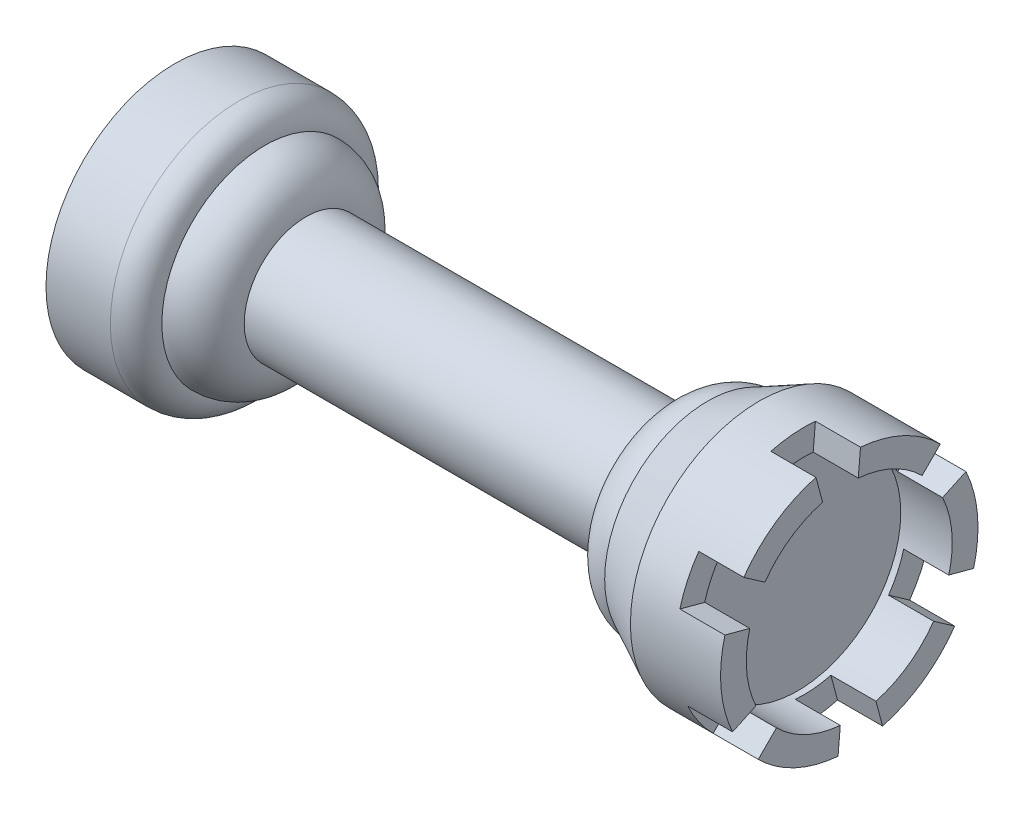
ISO-10303-21;
HEADER;
FILE_DESCRIPTION(('STEP AP214'),'2;1');
FILE_NAME('part.step','',(''),(''),'','','');
FILE_SCHEMA(('AUTOMOTIVE_DESIGN { 1 0 10303 214 1 1 1 1 }'));
ENDSEC;
DATA;
#1=APPLICATION_CONTEXT('core data for automotive mechanical design processes');
#2=APPLICATION_PROTOCOL_DEFINITION('international standard','automotive_design',2000,#1);
#3=PRODUCT_CONTEXT('',#1,'mechanical');
#4=PRODUCT('Part','Part','',(#3));
#5=PRODUCT_RELATED_PRODUCT_CATEGORY('part','',(#4));
#6=PRODUCT_DEFINITION_FORMATION('','',#4);
#7=PRODUCT_DEFINITION_CONTEXT('part definition',#1,'design');
#8=PRODUCT_DEFINITION('design','',#6,#7);
#9=PRODUCT_DEFINITION_SHAPE('','',#8);
#10=(LENGTH_UNIT() NAMED_UNIT(*) SI_UNIT(.MILLI.,.METRE.));
#11=(NAMED_UNIT(*) PLANE_ANGLE_UNIT() SI_UNIT($,.RADIAN.));
#12=(NAMED_UNIT(*) SI_UNIT($,.STERADIAN.) SOLID_ANGLE_UNIT());
#13=UNCERTAINTY_MEASURE_WITH_UNIT(LENGTH_MEASURE(1.E-05),#10,'distance_accuracy_value','');
#14=(GEOMETRIC_REPRESENTATION_CONTEXT(3) GLOBAL_UNCERTAINTY_ASSIGNED_CONTEXT((#13)) GLOBAL_UNIT_ASSIGNED_CONTEXT((#10,
#11,#12)) REPRESENTATION_CONTEXT('',''));
#15=CARTESIAN_POINT('',(0.,0.,0.));
#16=DIRECTION('',(0.,0.,1.));
#17=DIRECTION('',(1.,0.,0.));
#18=AXIS2_PLACEMENT_3D('',#15,#16,#17);
#19=CARTESIAN_POINT('',(10.2,0.,0.));
#20=DIRECTION('',(1.,0.,0.));
#21=DIRECTION('',(0.,0.,-1.));
#22=AXIS2_PLACEMENT_3D('',#19,#20,#21);
#23=PLANE('',#22);
#24=CARTESIAN_POINT('',(10.2,0.,0.));
#25=DIRECTION('',(-1.,0.,0.));
#26=DIRECTION('',(0.,0.,1.));
#27=AXIS2_PLACEMENT_3D('',#24,#25,#26);
#28=CIRCLE('',#27,4.8);
#29=CARTESIAN_POINT('',(10.2,0.,4.8));
#30=VERTEX_POINT('',#29);
#31=EDGE_CURVE('E11',#30,#30,#28,.T.);
#32=ORIENTED_EDGE('',*,*,#31,.F.);
#33=EDGE_LOOP('',(#32));
#34=FACE_BOUND('',#33,.T.);
#35=ADVANCED_FACE('F56',(#34),#23,.T.);
#36=CARTESIAN_POINT('',(7.,0.,0.));
#37=DIRECTION('',(-1.,0.,0.));
#38=DIRECTION('',(0.,0.,1.));
#39=AXIS2_PLACEMENT_3D('',#36,#37,#38);
#40=TOROIDAL_SURFACE('',#39,4.8,3.2);
#41=ORIENTED_EDGE('',*,*,#31,.T.);
#42=EDGE_LOOP('',(#41));
#43=FACE_BOUND('',#42,.T.);
#44=CARTESIAN_POINT('',(7.,0.,0.));
#45=DIRECTION('',(-1.,0.,0.));
#46=DIRECTION('',(0.,0.,1.));
#47=AXIS2_PLACEMENT_3D('',#44,#45,#46);
#48=CIRCLE('',#47,8.);
#49=CARTESIAN_POINT('',(7.,0.,8.));
#50=VERTEX_POINT('',#49);
#51=EDGE_CURVE('E63',#50,#50,#48,.T.);
#52=ORIENTED_EDGE('',*,*,#51,.F.);
#53=EDGE_LOOP('',(#52));
#54=FACE_BOUND('',#53,.T.);
#55=ADVANCED_FACE('F109',(#43,#54),#40,.T.);
#56=CARTESIAN_POINT('',(5.,0.,0.));
#57=DIRECTION('',(-1.,0.,0.));
#58=DIRECTION('',(0.,0.,1.));
#59=AXIS2_PLACEMENT_3D('',#56,#57,#58);
#60=TOROIDAL_SURFACE('',#59,8.,2.);
#61=ORIENTED_EDGE('',*,*,#51,.T.);
#62=EDGE_LOOP('',(#61));
#63=FACE_BOUND('',#62,.T.);
#64=CARTESIAN_POINT('',(5.,0.,0.));
#65=DIRECTION('',(-1.,0.,0.));
#66=DIRECTION('',(0.,0.,1.));
#67=AXIS2_PLACEMENT_3D('',#64,#65,#66);
#68=CIRCLE('',#67,10.);
#69=CARTESIAN_POINT('',(5.,0.,10.));
#70=VERTEX_POINT('',#69);
#71=EDGE_CURVE('E67',#70,#70,#68,.T.);
#72=ORIENTED_EDGE('',*,*,#71,.F.);
#73=EDGE_LOOP('',(#72));
#74=FACE_BOUND('',#73,.T.);
#75=ADVANCED_FACE('F106',(#63,#74),#60,.T.);
#76=CARTESIAN_POINT('',(0.,0.,0.));
#77=DIRECTION('',(-1.,0.,0.));
#78=DIRECTION('',(0.,0.,1.));
#79=AXIS2_PLACEMENT_3D('',#76,#77,#78);
#80=CYLINDRICAL_SURFACE('',#79,10.);
#81=ORIENTED_EDGE('',*,*,#71,.T.);
#82=EDGE_LOOP('',(#81));
#83=FACE_BOUND('',#82,.T.);
#84=CARTESIAN_POINT('',(0.,0.,0.));
#85=DIRECTION('',(-1.,0.,0.));
#86=DIRECTION('',(0.,0.,1.));
#87=AXIS2_PLACEMENT_3D('',#84,#85,#86);
#88=CIRCLE('',#87,10.);
#89=CARTESIAN_POINT('',(0.,0.,10.));
#90=VERTEX_POINT('',#89);
#91=EDGE_CURVE('E71',#90,#90,#88,.T.);
#92=ORIENTED_EDGE('',*,*,#91,.F.);
#93=EDGE_LOOP('',(#92));
#94=FACE_BOUND('',#93,.T.);
#95=ADVANCED_FACE('F102',(#83,#94),#80,.T.);
#96=CARTESIAN_POINT('',(0.,0.,0.));
#97=DIRECTION('',(-1.,0.,0.));
#98=DIRECTION('',(0.,0.,1.));
#99=AXIS2_PLACEMENT_3D('',#96,#97,#98);
#100=PLANE('',#99);
#101=ORIENTED_EDGE('',*,*,#91,.T.);
#102=EDGE_LOOP('',(#101));
#103=FACE_BOUND('',#102,.T.);
#104=ADVANCED_FACE('F100',(#103),#100,.T.);
#105=CLOSED_SHELL('',(#35,#55,#75,#95,#104));
#106=CARTESIAN_POINT('',(1.,0.,0.));
#107=DIRECTION('',(-1.,0.,0.));
#108=DIRECTION('',(0.,0.,1.));
#109=AXIS2_PLACEMENT_3D('',#106,#107,#108);
#110=PLANE('',#109);
#111=CARTESIAN_POINT('',(1.,0.,0.));
#112=DIRECTION('',(-1.,0.,0.));
#113=DIRECTION('',(0.,0.,1.));
#114=AXIS2_PLACEMENT_3D('',#111,#112,#113);
#115=CIRCLE('',#114,5.25);
#116=CARTESIAN_POINT('',(1.,0.,5.25));
#117=VERTEX_POINT('',#116);
#118=EDGE_CURVE('E76',#117,#117,#115,.T.);
#119=ORIENTED_EDGE('',*,*,#118,.F.);
#120=EDGE_LOOP('',(#119));
#121=FACE_BOUND('',#120,.T.);
#122=ADVANCED_FACE('F88',(#121),#110,.F.);
#123=CARTESIAN_POINT('',(0.,0.,0.));
#124=DIRECTION('',(-1.,0.,0.));
#125=DIRECTION('',(0.,0.,1.));
#126=AXIS2_PLACEMENT_3D('',#123,#124,#125);
#127=CYLINDRICAL_SURFACE('',#126,5.25);
#128=CARTESIAN_POINT('',(3.5,0.,0.));
#129=DIRECTION('',(-1.,0.,0.));
#130=DIRECTION('',(0.,0.,1.));
#131=AXIS2_PLACEMENT_3D('',#128,#129,#130);
#132=CIRCLE('',#131,5.25);
#133=CARTESIAN_POINT('',(3.5,0.,5.25));
#134=VERTEX_POINT('',#133);
#135=EDGE_CURVE('E79',#134,#134,#132,.T.);
#136=ORIENTED_EDGE('',*,*,#135,.F.);
#137=EDGE_LOOP('',(#136));
#138=FACE_BOUND('',#137,.T.);
#139=ORIENTED_EDGE('',*,*,#118,.T.);
#140=EDGE_LOOP('',(#139));
#141=FACE_BOUND('',#140,.T.);
#142=ADVANCED_FACE('F85',(#138,#141),#127,.F.);
#143=CARTESIAN_POINT('',(3.5,0.,0.));
#144=DIRECTION('',(1.,0.,0.));
#145=DIRECTION('',(0.,0.,-1.));
#146=AXIS2_PLACEMENT_3D('',#143,#144,#145);
#147=PLANE('',#146);
#148=ORIENTED_EDGE('',*,*,#135,.T.);
#149=EDGE_LOOP('',(#148));
#150=FACE_BOUND('',#149,.T.);
#151=ADVANCED_FACE('F83',(#150),#147,.F.);
#152=CLOSED_SHELL('',(#122,#142,#151));
#153=ORIENTED_CLOSED_SHELL('',*,#152,.T.);
#154=BREP_WITH_VOIDS('B2',#105,(#153));
#155=CARTESIAN_POINT('',(52.4,10.,0.));
#156=DIRECTION('',(1.,0.,0.));
#157=DIRECTION('',(0.,0.,-1.));
#158=AXIS2_PLACEMENT_3D('',#155,#156,#157);
#159=PLANE('',#158);
#160=DIRECTION('',(0.,-0.422618261740688,0.906307787036655));
#161=VECTOR('',#160,1.);
#162=CARTESIAN_POINT('',(52.4,-4.22618261740688,9.06307787036655));
#163=LINE('',#162,#161);
#164=CARTESIAN_POINT('',(52.4,-3.3809460939255,7.25046229629324));
#165=VERTEX_POINT('',#164);
#166=CARTESIAN_POINT('',(52.4,-4.22618261740688,9.06307787036655));
#167=VERTEX_POINT('',#166);
#168=EDGE_CURVE('E577',#165,#167,#163,.T.);
#169=ORIENTED_EDGE('',*,*,#168,.F.);
#170=CARTESIAN_POINT('',(52.4,0.,0.));
#171=DIRECTION('',(1.,0.,0.));
#172=DIRECTION('',(0.,0.,-1.));
#173=AXIS2_PLACEMENT_3D('',#170,#171,#172);
#174=CIRCLE('',#173,8.);
#175=CARTESIAN_POINT('',(52.4,2.07055236082017,7.72740661031255));
#176=VERTEX_POINT('',#175);
#177=EDGE_CURVE('E664',#176,#165,#174,.T.);
#178=ORIENTED_EDGE('',*,*,#177,.F.);
#179=DIRECTION('',(0.,-0.258819045102521,-0.965925826289068));
#180=VECTOR('',#179,1.);
#181=CARTESIAN_POINT('',(52.4,2.58819045102521,9.65925826289068));
#182=LINE('',#181,#180);
#183=CARTESIAN_POINT('',(52.4,2.58819045102521,9.65925826289068));
#184=VERTEX_POINT('',#183);
#185=EDGE_CURVE('E441',#184,#176,#182,.T.);
#186=ORIENTED_EDGE('',*,*,#185,.F.);
#187=CARTESIAN_POINT('',(52.4,0.,0.));
#188=DIRECTION('',(1.,0.,0.));
#189=DIRECTION('',(0.,0.,-1.));
#190=AXIS2_PLACEMENT_3D('',#187,#188,#189);
#191=CIRCLE('',#190,10.);
#192=EDGE_CURVE('E371',#184,#167,#191,.T.);
#193=ORIENTED_EDGE('',*,*,#192,.T.);
#194=EDGE_LOOP('',(#169,#178,#186,#193));
#195=FACE_BOUND('',#194,.T.);
#196=ADVANCED_FACE('F168',(#195),#159,.T.);
#197=DIRECTION('',(0.,0.707106781186539,-0.707106781186556));
#198=VECTOR('',#197,1.);
#199=CARTESIAN_POINT('',(52.4,-7.07106781186539,7.07106781186556));
#200=LINE('',#199,#198);
#201=CARTESIAN_POINT('',(52.4,-7.07106781186539,7.07106781186556));
#202=VERTEX_POINT('',#201);
#203=CARTESIAN_POINT('',(52.4,-5.65685424949231,5.65685424949245));
#204=VERTEX_POINT('',#203);
#205=EDGE_CURVE('E546',#202,#204,#200,.T.);
#206=ORIENTED_EDGE('',*,*,#205,.F.);
#207=CARTESIAN_POINT('',(52.4,-9.96194698091745,0.871557427476686));
#208=VERTEX_POINT('',#207);
#209=EDGE_CURVE('E384',#202,#208,#191,.T.);
#210=ORIENTED_EDGE('',*,*,#209,.T.);
#211=DIRECTION('',(0.,-0.996194698091745,0.0871557427476683));
#212=VECTOR('',#211,1.);
#213=CARTESIAN_POINT('',(52.4,-9.96194698091745,0.871557427476686));
#214=LINE('',#213,#212);
#215=CARTESIAN_POINT('',(52.4,-7.96955758473396,0.697245941981348));
#216=VERTEX_POINT('',#215);
#217=EDGE_CURVE('E547',#216,#208,#214,.T.);
#218=ORIENTED_EDGE('',*,*,#217,.F.);
#219=EDGE_CURVE('E407',#204,#216,#174,.T.);
#220=ORIENTED_EDGE('',*,*,#219,.F.);
#221=EDGE_LOOP('',(#206,#210,#218,#220));
#222=FACE_BOUND('',#221,.T.);
#223=ADVANCED_FACE('F690',(#222),#159,.T.);
#224=DIRECTION('',(0.,0.965925826289071,0.258819045102511));
#225=VECTOR('',#224,1.);
#226=CARTESIAN_POINT('',(52.4,-9.65925826289071,-2.58819045102511));
#227=LINE('',#226,#225);
#228=CARTESIAN_POINT('',(52.4,-9.65925826289071,-2.58819045102511));
#229=VERTEX_POINT('',#228);
#230=CARTESIAN_POINT('',(52.4,-7.72740661031257,-2.07055236082009));
#231=VERTEX_POINT('',#230);
#232=EDGE_CURVE('E512',#229,#231,#227,.T.);
#233=ORIENTED_EDGE('',*,*,#232,.F.);
#234=CARTESIAN_POINT('',(52.4,-5.73576436351053,-8.19152044288987));
#235=VERTEX_POINT('',#234);
#236=EDGE_CURVE('E375',#229,#235,#191,.T.);
#237=ORIENTED_EDGE('',*,*,#236,.T.);
#238=DIRECTION('',(0.,-0.573576436351053,-0.819152044288987));
#239=VECTOR('',#238,1.);
#240=CARTESIAN_POINT('',(52.4,-5.73576436351053,-8.19152044288987));
#241=LINE('',#240,#239);
#242=CARTESIAN_POINT('',(52.4,-4.58861149080842,-6.5532163543119));
#243=VERTEX_POINT('',#242);
#244=EDGE_CURVE('E513',#243,#235,#241,.T.);
#245=ORIENTED_EDGE('',*,*,#244,.F.);
#246=EDGE_CURVE('E398',#231,#243,#174,.T.);
#247=ORIENTED_EDGE('',*,*,#246,.F.);
#248=EDGE_LOOP('',(#233,#237,#245,#247));
#249=FACE_BOUND('',#248,.T.);
#250=ADVANCED_FACE('F646',(#249),#159,.T.);
#251=DIRECTION('',(0.,0.258819045102528,0.965925826289066));
#252=VECTOR('',#251,1.);
#253=CARTESIAN_POINT('',(52.4,-2.58819045102528,-9.65925826289066));
#254=LINE('',#253,#252);
#255=CARTESIAN_POINT('',(52.4,-2.58819045102528,-9.65925826289066));
#256=VERTEX_POINT('',#255);
#257=CARTESIAN_POINT('',(52.4,-2.07055236082022,-7.72740661031253));
#258=VERTEX_POINT('',#257);
#259=EDGE_CURVE('E479',#256,#258,#254,.T.);
#260=ORIENTED_EDGE('',*,*,#259,.F.);
#261=CARTESIAN_POINT('',(52.4,4.22618261740694,-9.06307787036653));
#262=VERTEX_POINT('',#261);
#263=EDGE_CURVE('E364',#256,#262,#191,.T.);
#264=ORIENTED_EDGE('',*,*,#263,.T.);
#265=DIRECTION('',(0.,0.422618261740694,-0.906307787036653));
#266=VECTOR('',#265,1.);
#267=CARTESIAN_POINT('',(52.4,4.22618261740694,-9.06307787036653));
#268=LINE('',#267,#266);
#269=CARTESIAN_POINT('',(52.4,3.38094609392555,-7.25046229629322));
#270=VERTEX_POINT('',#269);
#271=EDGE_CURVE('E480',#270,#262,#268,.T.);
#272=ORIENTED_EDGE('',*,*,#271,.F.);
#273=EDGE_CURVE('E392',#258,#270,#174,.T.);
#274=ORIENTED_EDGE('',*,*,#273,.F.);
#275=EDGE_LOOP('',(#260,#264,#272,#274));
#276=FACE_BOUND('',#275,.T.);
#277=ADVANCED_FACE('F628',(#276),#159,.T.);
#278=DIRECTION('',(0.,-0.707106781186543,0.707106781186552));
#279=VECTOR('',#278,1.);
#280=CARTESIAN_POINT('',(52.4,7.07106781186544,-7.07106781186551));
#281=LINE('',#280,#279);
#282=CARTESIAN_POINT('',(52.4,7.07106781186544,-7.07106781186551));
#283=VERTEX_POINT('',#282);
#284=CARTESIAN_POINT('',(52.4,5.65685424949235,-5.65685424949241));
#285=VERTEX_POINT('',#284);
#286=EDGE_CURVE('E356',#283,#285,#281,.T.);
#287=ORIENTED_EDGE('',*,*,#286,.F.);
#288=CARTESIAN_POINT('',(52.4,9.96194698091745,-0.871557427476619));
#289=VERTEX_POINT('',#288);
#290=EDGE_CURVE('E352',#283,#289,#191,.T.);
#291=ORIENTED_EDGE('',*,*,#290,.T.);
#292=DIRECTION('',(0.,0.996194698091745,-0.0871557427476618));
#293=VECTOR('',#292,1.);
#294=CARTESIAN_POINT('',(52.4,9.96194698091745,-0.871557427476619));
#295=LINE('',#294,#293);
#296=CARTESIAN_POINT('',(52.4,7.96955758473396,-0.697245941981296));
#297=VERTEX_POINT('',#296);
#298=EDGE_CURVE('E329',#297,#289,#295,.T.);
#299=ORIENTED_EDGE('',*,*,#298,.F.);
#300=EDGE_CURVE('E386',#285,#297,#174,.T.);
#301=ORIENTED_EDGE('',*,*,#300,.F.);
#302=EDGE_LOOP('',(#287,#291,#299,#301));
#303=FACE_BOUND('',#302,.T.);
#304=ADVANCED_FACE('F359',(#303),#159,.T.);
#305=CARTESIAN_POINT('',(41.4,0.,0.));
#306=DIRECTION('',(1.,0.,0.));
#307=DIRECTION('',(0.,0.,-1.));
#308=AXIS2_PLACEMENT_3D('',#305,#306,#307);
#309=CONICAL_SURFACE('',#308,8.,0.463647609000806);
#310=CARTESIAN_POINT('',(45.4,0.,0.));
#311=DIRECTION('',(1.,0.,0.));
#312=DIRECTION('',(0.,0.,-1.));
#313=AXIS2_PLACEMENT_3D('',#310,#311,#312);
#314=CIRCLE('',#313,10.);
#315=CARTESIAN_POINT('',(45.4,0.,-10.));
#316=VERTEX_POINT('',#315);
#317=EDGE_CURVE('E361',#316,#316,#314,.T.);
#318=ORIENTED_EDGE('',*,*,#317,.F.);
#319=EDGE_LOOP('',(#318));
#320=FACE_BOUND('',#319,.T.);
#321=CARTESIAN_POINT('',(41.4,0.,0.));
#322=DIRECTION('',(-1.,0.,0.));
#323=DIRECTION('',(0.,0.,1.));
#324=AXIS2_PLACEMENT_3D('',#321,#322,#323);
#325=CIRCLE('',#324,8.);
#326=CARTESIAN_POINT('',(41.4,0.,8.));
#327=VERTEX_POINT('',#326);
#328=EDGE_CURVE('E53',#327,#327,#325,.T.);
#329=ORIENTED_EDGE('',*,*,#328,.F.);
#330=EDGE_LOOP('',(#329));
#331=FACE_BOUND('',#330,.T.);
#332=ADVANCED_FACE('F170',(#320,#331),#309,.T.);
#333=CARTESIAN_POINT('',(41.4,0.,0.));
#334=DIRECTION('',(-1.,0.,0.));
#335=DIRECTION('',(0.,0.,1.));
#336=AXIS2_PLACEMENT_3D('',#333,#334,#335);
#337=TOROIDAL_SURFACE('',#336,4.8,3.2);
#338=ORIENTED_EDGE('',*,*,#328,.T.);
#339=EDGE_LOOP('',(#338));
#340=FACE_BOUND('',#339,.T.);
#341=CARTESIAN_POINT('',(38.2,0.,0.));
#342=DIRECTION('',(-1.,0.,0.));
#343=DIRECTION('',(0.,0.,1.));
#344=AXIS2_PLACEMENT_3D('',#341,#342,#343);
#345=CIRCLE('',#344,4.8);
#346=CARTESIAN_POINT('',(38.2,0.,4.8));
#347=VERTEX_POINT('',#346);
#348=EDGE_CURVE('E177',#347,#347,#345,.T.);
#349=ORIENTED_EDGE('',*,*,#348,.F.);
#350=EDGE_LOOP('',(#349));
#351=FACE_BOUND('',#350,.T.);
#352=ADVANCED_FACE('F710',(#340,#351),#337,.T.);
#353=CARTESIAN_POINT('',(10.2,0.,0.));
#354=DIRECTION('',(-1.,0.,0.));
#355=DIRECTION('',(0.,0.,1.));
#356=AXIS2_PLACEMENT_3D('',#353,#354,#355);
#357=CYLINDRICAL_SURFACE('',#356,4.8);
#358=ORIENTED_EDGE('',*,*,#348,.T.);
#359=EDGE_LOOP('',(#358));
#360=FACE_BOUND('',#359,.T.);
#361=CARTESIAN_POINT('',(10.2,0.,0.));
#362=DIRECTION('',(-1.,0.,0.));
#363=DIRECTION('',(0.,0.,1.));
#364=AXIS2_PLACEMENT_3D('',#361,#362,#363);
#365=CIRCLE('',#364,4.8);
#366=CARTESIAN_POINT('',(10.2,0.,4.8));
#367=VERTEX_POINT('',#366);
#368=EDGE_CURVE('E368',#367,#367,#365,.T.);
#369=ORIENTED_EDGE('',*,*,#368,.F.);
#370=EDGE_LOOP('',(#369));
#371=FACE_BOUND('',#370,.T.);
#372=ADVANCED_FACE('F880',(#360,#371),#357,.T.);
#373=CARTESIAN_POINT('',(10.2,0.,0.));
#374=DIRECTION('',(1.,0.,0.));
#375=DIRECTION('',(0.,0.,-1.));
#376=AXIS2_PLACEMENT_3D('',#373,#374,#375);
#377=PLANE('',#376);
#378=ORIENTED_EDGE('',*,*,#368,.T.);
#379=EDGE_LOOP('',(#378));
#380=FACE_BOUND('',#379,.T.);
#381=ADVANCED_FACE('F704',(#380),#377,.F.);
#382=CARTESIAN_POINT('',(52.4,0.,0.));
#383=DIRECTION('',(1.,0.,0.));
#384=DIRECTION('',(0.,0.,-1.));
#385=AXIS2_PLACEMENT_3D('',#382,#383,#384);
#386=CYLINDRICAL_SURFACE('',#385,10.);
#387=DIRECTION('',(1.,0.,0.));
#388=VECTOR('',#387,1.);
#389=CARTESIAN_POINT('',(48.9,-4.22618261740688,9.06307787036655));
#390=LINE('',#389,#388);
#391=CARTESIAN_POINT('',(48.9,-4.22618261740688,9.06307787036655));
#392=VERTEX_POINT('',#391);
#393=EDGE_CURVE('E574',#392,#167,#390,.T.);
#394=ORIENTED_EDGE('',*,*,#393,.T.);
#395=ORIENTED_EDGE('',*,*,#192,.F.);
#396=DIRECTION('',(1.,0.,0.));
#397=VECTOR('',#396,1.);
#398=CARTESIAN_POINT('',(48.9,2.58819045102521,9.65925826289068));
#399=LINE('',#398,#397);
#400=CARTESIAN_POINT('',(48.9,2.58819045102521,9.65925826289068));
#401=VERTEX_POINT('',#400);
#402=EDGE_CURVE('E394',#401,#184,#399,.T.);
#403=ORIENTED_EDGE('',*,*,#402,.F.);
#404=CARTESIAN_POINT('',(48.9,0.,0.));
#405=DIRECTION('',(1.,0.,0.));
#406=DIRECTION('',(0.,0.,1.));
#407=AXIS2_PLACEMENT_3D('',#404,#405,#406);
#408=CIRCLE('',#407,10.);
#409=CARTESIAN_POINT('',(48.9,5.73576436351047,8.19152044288991));
#410=VERTEX_POINT('',#409);
#411=EDGE_CURVE('E445',#410,#401,#408,.T.);
#412=ORIENTED_EDGE('',*,*,#411,.F.);
#413=DIRECTION('',(1.,0.,0.));
#414=VECTOR('',#413,1.);
#415=CARTESIAN_POINT('',(48.9,5.73576436351047,8.19152044288991));
#416=LINE('',#415,#414);
#417=CARTESIAN_POINT('',(52.4,5.73576436351047,8.19152044288991));
#418=VERTEX_POINT('',#417);
#419=EDGE_CURVE('E399',#410,#418,#416,.T.);
#420=ORIENTED_EDGE('',*,*,#419,.T.);
#421=CARTESIAN_POINT('',(52.4,9.65925826289069,2.58819045102518));
#422=VERTEX_POINT('',#421);
#423=EDGE_CURVE('E362',#422,#418,#191,.T.);
#424=ORIENTED_EDGE('',*,*,#423,.F.);
#425=DIRECTION('',(1.,0.,0.));
#426=VECTOR('',#425,1.);
#427=CARTESIAN_POINT('',(48.9,9.65925826289069,2.58819045102518));
#428=LINE('',#427,#426);
#429=CARTESIAN_POINT('',(48.9,9.65925826289069,2.58819045102518));
#430=VERTEX_POINT('',#429);
#431=EDGE_CURVE('E456',#430,#422,#428,.T.);
#432=ORIENTED_EDGE('',*,*,#431,.F.);
#433=CARTESIAN_POINT('',(48.9,0.,0.));
#434=DIRECTION('',(1.,0.,0.));
#435=DIRECTION('',(0.,0.,1.));
#436=AXIS2_PLACEMENT_3D('',#433,#434,#435);
#437=CIRCLE('',#436,10.);
#438=CARTESIAN_POINT('',(48.9,9.96194698091745,-0.871557427476619));
#439=VERTEX_POINT('',#438);
#440=EDGE_CURVE('E343',#439,#430,#437,.T.);
#441=ORIENTED_EDGE('',*,*,#440,.F.);
#442=DIRECTION('',(1.,0.,0.));
#443=VECTOR('',#442,1.);
#444=CARTESIAN_POINT('',(48.9,9.96194698091745,-0.871557427476619));
#445=LINE('',#444,#443);
#446=EDGE_CURVE('E333',#439,#289,#445,.T.);
#447=ORIENTED_EDGE('',*,*,#446,.T.);
#448=ORIENTED_EDGE('',*,*,#290,.F.);
#449=DIRECTION('',(1.,0.,0.));
#450=VECTOR('',#449,1.);
#451=CARTESIAN_POINT('',(48.9,7.07106781186544,-7.07106781186551));
#452=LINE('',#451,#450);
#453=CARTESIAN_POINT('',(48.9,7.07106781186544,-7.07106781186551));
#454=VERTEX_POINT('',#453);
#455=EDGE_CURVE('E464',#454,#283,#452,.T.);
#456=ORIENTED_EDGE('',*,*,#455,.F.);
#457=CARTESIAN_POINT('',(48.9,0.,0.));
#458=DIRECTION('',(1.,0.,0.));
#459=DIRECTION('',(0.,0.,1.));
#460=AXIS2_PLACEMENT_3D('',#457,#458,#459);
#461=CIRCLE('',#460,10.);
#462=CARTESIAN_POINT('',(48.9,4.22618261740694,-9.06307787036653));
#463=VERTEX_POINT('',#462);
#464=EDGE_CURVE('E483',#463,#454,#461,.T.);
#465=ORIENTED_EDGE('',*,*,#464,.F.);
#466=DIRECTION('',(1.,0.,0.));
#467=VECTOR('',#466,1.);
#468=CARTESIAN_POINT('',(48.9,4.22618261740694,-9.06307787036653));
#469=LINE('',#468,#467);
#470=EDGE_CURVE('E475',#463,#262,#469,.T.);
#471=ORIENTED_EDGE('',*,*,#470,.T.);
#472=ORIENTED_EDGE('',*,*,#263,.F.);
#473=DIRECTION('',(1.,0.,0.));
#474=VECTOR('',#473,1.);
#475=CARTESIAN_POINT('',(48.9,-2.58819045102528,-9.65925826289066));
#476=LINE('',#475,#474);
#477=CARTESIAN_POINT('',(48.9,-2.58819045102528,-9.65925826289066));
#478=VERTEX_POINT('',#477);
#479=EDGE_CURVE('E498',#478,#256,#476,.T.);
#480=ORIENTED_EDGE('',*,*,#479,.F.);
#481=CARTESIAN_POINT('',(48.9,0.,0.));
#482=DIRECTION('',(1.,0.,0.));
#483=DIRECTION('',(0.,0.,1.));
#484=AXIS2_PLACEMENT_3D('',#481,#482,#483);
#485=CIRCLE('',#484,10.);
#486=CARTESIAN_POINT('',(48.9,-5.73576436351053,-8.19152044288987));
#487=VERTEX_POINT('',#486);
#488=EDGE_CURVE('E516',#487,#478,#485,.T.);
#489=ORIENTED_EDGE('',*,*,#488,.F.);
#490=DIRECTION('',(1.,0.,0.));
#491=VECTOR('',#490,1.);
#492=CARTESIAN_POINT('',(48.9,-5.73576436351053,-8.19152044288987));
#493=LINE('',#492,#491);
#494=EDGE_CURVE('E508',#487,#235,#493,.T.);
#495=ORIENTED_EDGE('',*,*,#494,.T.);
#496=ORIENTED_EDGE('',*,*,#236,.F.);
#497=DIRECTION('',(1.,0.,0.));
#498=VECTOR('',#497,1.);
#499=CARTESIAN_POINT('',(48.9,-9.65925826289071,-2.58819045102511));
#500=LINE('',#499,#498);
#501=CARTESIAN_POINT('',(48.9,-9.65925826289071,-2.58819045102511));
#502=VERTEX_POINT('',#501);
#503=EDGE_CURVE('E531',#502,#229,#500,.T.);
#504=ORIENTED_EDGE('',*,*,#503,.F.);
#505=CARTESIAN_POINT('',(48.9,0.,0.));
#506=DIRECTION('',(1.,0.,0.));
#507=DIRECTION('',(0.,0.,1.));
#508=AXIS2_PLACEMENT_3D('',#505,#506,#507);
#509=CIRCLE('',#508,10.);
#510=CARTESIAN_POINT('',(48.9,-9.96194698091745,0.871557427476686));
#511=VERTEX_POINT('',#510);
#512=EDGE_CURVE('E550',#511,#502,#509,.T.);
#513=ORIENTED_EDGE('',*,*,#512,.F.);
#514=DIRECTION('',(1.,0.,0.));
#515=VECTOR('',#514,1.);
#516=CARTESIAN_POINT('',(48.9,-9.96194698091745,0.871557427476686));
#517=LINE('',#516,#515);
#518=EDGE_CURVE('E542',#511,#208,#517,.T.);
#519=ORIENTED_EDGE('',*,*,#518,.T.);
#520=ORIENTED_EDGE('',*,*,#209,.F.);
#521=DIRECTION('',(1.,0.,0.));
#522=VECTOR('',#521,1.);
#523=CARTESIAN_POINT('',(48.9,-7.07106781186539,7.07106781186556));
#524=LINE('',#523,#522);
#525=CARTESIAN_POINT('',(48.9,-7.07106781186539,7.07106781186556));
#526=VERTEX_POINT('',#525);
#527=EDGE_CURVE('E563',#526,#202,#524,.T.);
#528=ORIENTED_EDGE('',*,*,#527,.F.);
#529=CARTESIAN_POINT('',(48.9,0.,0.));
#530=DIRECTION('',(1.,0.,0.));
#531=DIRECTION('',(0.,0.,1.));
#532=AXIS2_PLACEMENT_3D('',#529,#530,#531);
#533=CIRCLE('',#532,10.);
#534=EDGE_CURVE('E580',#392,#526,#533,.T.);
#535=ORIENTED_EDGE('',*,*,#534,.F.);
#536=EDGE_LOOP('',(#394,#395,#403,#412,#420,#424,#432,#441,#447,#448,#456,#465,#471,#472,#480,
#489,#495,#496,#504,#513,#519,#520,#528,#535));
#537=FACE_BOUND('',#536,.T.);
#538=ORIENTED_EDGE('',*,*,#317,.T.);
#539=EDGE_LOOP('',(#538));
#540=FACE_BOUND('',#539,.T.);
#541=ADVANCED_FACE('F349',(#537,#540),#386,.T.);
#542=DIRECTION('',(0.,-0.965925826289069,-0.258819045102518));
#543=VECTOR('',#542,1.);
#544=CARTESIAN_POINT('',(52.4,9.65925826289069,2.58819045102518));
#545=LINE('',#544,#543);
#546=CARTESIAN_POINT('',(52.4,7.72740661031255,2.07055236082014));
#547=VERTEX_POINT('',#546);
#548=EDGE_CURVE('E342',#422,#547,#545,.T.);
#549=ORIENTED_EDGE('',*,*,#548,.F.);
#550=ORIENTED_EDGE('',*,*,#423,.T.);
#551=DIRECTION('',(0.,0.573576436351047,0.819152044288991));
#552=VECTOR('',#551,1.);
#553=CARTESIAN_POINT('',(52.4,5.73576436351047,8.19152044288991));
#554=LINE('',#553,#552);
#555=CARTESIAN_POINT('',(52.4,4.58861149080838,6.55321635431193));
#556=VERTEX_POINT('',#555);
#557=EDGE_CURVE('E417',#556,#418,#554,.T.);
#558=ORIENTED_EDGE('',*,*,#557,.F.);
#559=EDGE_CURVE('E391',#547,#556,#174,.T.);
#560=ORIENTED_EDGE('',*,*,#559,.F.);
#561=EDGE_LOOP('',(#549,#550,#558,#560));
#562=FACE_BOUND('',#561,.T.);
#563=ADVANCED_FACE('F606',(#562),#159,.T.);
#564=CARTESIAN_POINT('',(48.4,0.,0.));
#565=DIRECTION('',(1.,0.,0.));
#566=DIRECTION('',(0.,0.,-1.));
#567=AXIS2_PLACEMENT_3D('',#564,#565,#566);
#568=CYLINDRICAL_SURFACE('',#567,8.);
#569=ORIENTED_EDGE('',*,*,#177,.T.);
#570=DIRECTION('',(1.,0.,0.));
#571=VECTOR('',#570,1.);
#572=CARTESIAN_POINT('',(48.9,-3.3809460939255,7.25046229629324));
#573=LINE('',#572,#571);
#574=CARTESIAN_POINT('',(48.9,-3.3809460939255,7.25046229629324));
#575=VERTEX_POINT('',#574);
#576=EDGE_CURVE('E571',#575,#165,#573,.T.);
#577=ORIENTED_EDGE('',*,*,#576,.F.);
#578=CARTESIAN_POINT('',(48.9,0.,0.));
#579=DIRECTION('',(-1.,0.,0.));
#580=DIRECTION('',(0.,0.,1.));
#581=AXIS2_PLACEMENT_3D('',#578,#579,#580);
#582=CIRCLE('',#581,8.);
#583=CARTESIAN_POINT('',(48.9,-5.65685424949231,5.65685424949245));
#584=VERTEX_POINT('',#583);
#585=EDGE_CURVE('E586',#584,#575,#582,.T.);
#586=ORIENTED_EDGE('',*,*,#585,.F.);
#587=DIRECTION('',(1.,0.,0.));
#588=VECTOR('',#587,1.);
#589=CARTESIAN_POINT('',(48.9,-5.65685424949231,5.65685424949245));
#590=LINE('',#589,#588);
#591=EDGE_CURVE('E567',#584,#204,#590,.T.);
#592=ORIENTED_EDGE('',*,*,#591,.T.);
#593=ORIENTED_EDGE('',*,*,#219,.T.);
#594=DIRECTION('',(1.,0.,0.));
#595=VECTOR('',#594,1.);
#596=CARTESIAN_POINT('',(48.9,-7.96955758473396,0.697245941981348));
#597=LINE('',#596,#595);
#598=CARTESIAN_POINT('',(48.9,-7.96955758473396,0.697245941981348));
#599=VERTEX_POINT('',#598);
#600=EDGE_CURVE('E539',#599,#216,#597,.T.);
#601=ORIENTED_EDGE('',*,*,#600,.F.);
#602=CARTESIAN_POINT('',(48.9,0.,0.));
#603=DIRECTION('',(-1.,0.,0.));
#604=DIRECTION('',(0.,0.,1.));
#605=AXIS2_PLACEMENT_3D('',#602,#603,#604);
#606=CIRCLE('',#605,8.);
#607=CARTESIAN_POINT('',(48.9,-7.72740661031257,-2.07055236082009));
#608=VERTEX_POINT('',#607);
#609=EDGE_CURVE('E556',#608,#599,#606,.T.);
#610=ORIENTED_EDGE('',*,*,#609,.F.);
#611=DIRECTION('',(1.,0.,0.));
#612=VECTOR('',#611,1.);
#613=CARTESIAN_POINT('',(48.9,-7.72740661031257,-2.07055236082009));
#614=LINE('',#613,#612);
#615=EDGE_CURVE('E535',#608,#231,#614,.T.);
#616=ORIENTED_EDGE('',*,*,#615,.T.);
#617=ORIENTED_EDGE('',*,*,#246,.T.);
#618=DIRECTION('',(1.,0.,0.));
#619=VECTOR('',#618,1.);
#620=CARTESIAN_POINT('',(48.9,-4.58861149080842,-6.5532163543119));
#621=LINE('',#620,#619);
#622=CARTESIAN_POINT('',(48.9,-4.58861149080842,-6.5532163543119));
#623=VERTEX_POINT('',#622);
#624=EDGE_CURVE('E505',#623,#243,#621,.T.);
#625=ORIENTED_EDGE('',*,*,#624,.F.);
#626=CARTESIAN_POINT('',(48.9,0.,0.));
#627=DIRECTION('',(-1.,0.,0.));
#628=DIRECTION('',(0.,0.,1.));
#629=AXIS2_PLACEMENT_3D('',#626,#627,#628);
#630=CIRCLE('',#629,8.);
#631=CARTESIAN_POINT('',(48.9,-2.07055236082022,-7.72740661031253));
#632=VERTEX_POINT('',#631);
#633=EDGE_CURVE('E522',#632,#623,#630,.T.);
#634=ORIENTED_EDGE('',*,*,#633,.F.);
#635=DIRECTION('',(1.,0.,0.));
#636=VECTOR('',#635,1.);
#637=CARTESIAN_POINT('',(48.9,-2.07055236082022,-7.72740661031253));
#638=LINE('',#637,#636);
#639=EDGE_CURVE('E502',#632,#258,#638,.T.);
#640=ORIENTED_EDGE('',*,*,#639,.T.);
#641=ORIENTED_EDGE('',*,*,#273,.T.);
#642=DIRECTION('',(1.,0.,0.));
#643=VECTOR('',#642,1.);
#644=CARTESIAN_POINT('',(48.9,3.38094609392555,-7.25046229629322));
#645=LINE('',#644,#643);
#646=CARTESIAN_POINT('',(48.9,3.38094609392555,-7.25046229629322));
#647=VERTEX_POINT('',#646);
#648=EDGE_CURVE('E472',#647,#270,#645,.T.);
#649=ORIENTED_EDGE('',*,*,#648,.F.);
#650=CARTESIAN_POINT('',(48.9,0.,0.));
#651=DIRECTION('',(-1.,0.,0.));
#652=DIRECTION('',(0.,0.,1.));
#653=AXIS2_PLACEMENT_3D('',#650,#651,#652);
#654=CIRCLE('',#653,8.);
#655=CARTESIAN_POINT('',(48.9,5.65685424949235,-5.65685424949241));
#656=VERTEX_POINT('',#655);
#657=EDGE_CURVE('E489',#656,#647,#654,.T.);
#658=ORIENTED_EDGE('',*,*,#657,.F.);
#659=DIRECTION('',(1.,0.,0.));
#660=VECTOR('',#659,1.);
#661=CARTESIAN_POINT('',(48.9,5.65685424949235,-5.65685424949241));
#662=LINE('',#661,#660);
#663=EDGE_CURVE('E468',#656,#285,#662,.T.);
#664=ORIENTED_EDGE('',*,*,#663,.T.);
#665=ORIENTED_EDGE('',*,*,#300,.T.);
#666=DIRECTION('',(1.,0.,0.));
#667=VECTOR('',#666,1.);
#668=CARTESIAN_POINT('',(48.9,7.96955758473396,-0.697245941981296));
#669=LINE('',#668,#667);
#670=CARTESIAN_POINT('',(48.9,7.96955758473396,-0.697245941981296));
#671=VERTEX_POINT('',#670);
#672=EDGE_CURVE('E336',#671,#297,#669,.T.);
#673=ORIENTED_EDGE('',*,*,#672,.F.);
#674=CARTESIAN_POINT('',(48.9,0.,0.));
#675=DIRECTION('',(-1.,0.,0.));
#676=DIRECTION('',(0.,0.,1.));
#677=AXIS2_PLACEMENT_3D('',#674,#675,#676);
#678=CIRCLE('',#677,8.);
#679=CARTESIAN_POINT('',(48.9,7.72740661031255,2.07055236082014));
#680=VERTEX_POINT('',#679);
#681=EDGE_CURVE('E455',#680,#671,#678,.T.);
#682=ORIENTED_EDGE('',*,*,#681,.F.);
#683=DIRECTION('',(1.,0.,0.));
#684=VECTOR('',#683,1.);
#685=CARTESIAN_POINT('',(48.9,7.72740661031255,2.07055236082014));
#686=LINE('',#685,#684);
#687=EDGE_CURVE('E608',#680,#547,#686,.T.);
#688=ORIENTED_EDGE('',*,*,#687,.T.);
#689=ORIENTED_EDGE('',*,*,#559,.T.);
#690=DIRECTION('',(1.,0.,0.));
#691=VECTOR('',#690,1.);
#692=CARTESIAN_POINT('',(48.9,4.58861149080838,6.55321635431193));
#693=LINE('',#692,#691);
#694=CARTESIAN_POINT('',(48.9,4.58861149080838,6.55321635431193));
#695=VERTEX_POINT('',#694);
#696=EDGE_CURVE('E409',#695,#556,#693,.T.);
#697=ORIENTED_EDGE('',*,*,#696,.F.);
#698=CARTESIAN_POINT('',(48.9,0.,0.));
#699=DIRECTION('',(-1.,0.,0.));
#700=DIRECTION('',(0.,0.,1.));
#701=AXIS2_PLACEMENT_3D('',#698,#699,#700);
#702=CIRCLE('',#701,8.);
#703=CARTESIAN_POINT('',(48.9,2.07055236082017,7.72740661031255));
#704=VERTEX_POINT('',#703);
#705=EDGE_CURVE('E432',#704,#695,#702,.T.);
#706=ORIENTED_EDGE('',*,*,#705,.F.);
#707=DIRECTION('',(1.,0.,0.));
#708=VECTOR('',#707,1.);
#709=CARTESIAN_POINT('',(48.9,2.07055236082017,7.72740661031255));
#710=LINE('',#709,#708);
#711=EDGE_CURVE('E414',#704,#176,#710,.T.);
#712=ORIENTED_EDGE('',*,*,#711,.T.);
#713=EDGE_LOOP('',(#569,#577,#586,#592,#593,#601,#610,#616,#617,#625,#634,#640,#641,#649,#658,
#664,#665,#673,#682,#688,#689,#697,#706,#712));
#714=FACE_BOUND('',#713,.T.);
#715=CARTESIAN_POINT('',(48.4,0.,0.));
#716=DIRECTION('',(1.,0.,0.));
#717=DIRECTION('',(0.,0.,-1.));
#718=AXIS2_PLACEMENT_3D('',#715,#716,#717);
#719=CIRCLE('',#718,8.);
#720=CARTESIAN_POINT('',(48.4,0.,-8.));
#721=VERTEX_POINT('',#720);
#722=EDGE_CURVE('E376',#721,#721,#719,.T.);
#723=ORIENTED_EDGE('',*,*,#722,.F.);
#724=EDGE_LOOP('',(#723));
#725=FACE_BOUND('',#724,.T.);
#726=ADVANCED_FACE('F598',(#714,#725),#568,.F.);
#727=CARTESIAN_POINT('',(48.4,0.,0.));
#728=DIRECTION('',(1.,0.,0.));
#729=DIRECTION('',(0.,0.,-1.));
#730=AXIS2_PLACEMENT_3D('',#727,#728,#729);
#731=PLANE('',#730);
#732=ORIENTED_EDGE('',*,*,#722,.T.);
#733=EDGE_LOOP('',(#732));
#734=FACE_BOUND('',#733,.T.);
#735=ADVANCED_FACE('F703',(#734),#731,.T.);
#736=CARTESIAN_POINT('',(48.9,5.73576436351047,8.19152044288991));
#737=DIRECTION('',(0.,0.819152044288991,-0.573576436351047));
#738=DIRECTION('',(0.,0.573576436351047,0.819152044288991));
#739=AXIS2_PLACEMENT_3D('',#736,#737,#738);
#740=PLANE('',#739);
#741=ORIENTED_EDGE('',*,*,#557,.T.);
#742=ORIENTED_EDGE('',*,*,#419,.F.);
#743=DIRECTION('',(0.,0.573576436351047,0.819152044288991));
#744=VECTOR('',#743,1.);
#745=CARTESIAN_POINT('',(48.9,5.73576436351047,8.19152044288991));
#746=LINE('',#745,#744);
#747=EDGE_CURVE('E426',#695,#410,#746,.T.);
#748=ORIENTED_EDGE('',*,*,#747,.F.);
#749=ORIENTED_EDGE('',*,*,#696,.T.);
#750=EDGE_LOOP('',(#741,#742,#748,#749));
#751=FACE_BOUND('',#750,.T.);
#752=ADVANCED_FACE('F604',(#751),#740,.F.);
#753=CARTESIAN_POINT('',(48.9,2.58819045102521,9.65925826289068));
#754=DIRECTION('',(0.,-0.965925826289068,0.258819045102521));
#755=DIRECTION('',(0.,-0.258819045102521,-0.965925826289068));
#756=AXIS2_PLACEMENT_3D('',#753,#754,#755);
#757=PLANE('',#756);
#758=ORIENTED_EDGE('',*,*,#185,.T.);
#759=ORIENTED_EDGE('',*,*,#711,.F.);
#760=DIRECTION('',(0.,-0.258819045102521,-0.965925826289068));
#761=VECTOR('',#760,1.);
#762=CARTESIAN_POINT('',(48.9,2.58819045102521,9.65925826289068));
#763=LINE('',#762,#761);
#764=EDGE_CURVE('E438',#401,#704,#763,.T.);
#765=ORIENTED_EDGE('',*,*,#764,.F.);
#766=ORIENTED_EDGE('',*,*,#402,.T.);
#767=EDGE_LOOP('',(#758,#759,#765,#766));
#768=FACE_BOUND('',#767,.T.);
#769=ADVANCED_FACE('F596',(#768),#757,.F.);
#770=CARTESIAN_POINT('',(48.9,0.,0.));
#771=DIRECTION('',(-1.,0.,0.));
#772=DIRECTION('',(0.,0.,1.));
#773=AXIS2_PLACEMENT_3D('',#770,#771,#772);
#774=PLANE('',#773);
#775=ORIENTED_EDGE('',*,*,#411,.T.);
#776=ORIENTED_EDGE('',*,*,#764,.T.);
#777=ORIENTED_EDGE('',*,*,#705,.T.);
#778=ORIENTED_EDGE('',*,*,#747,.T.);
#779=EDGE_LOOP('',(#775,#776,#777,#778));
#780=FACE_BOUND('',#779,.T.);
#781=ADVANCED_FACE('F595',(#780),#774,.F.);
#782=CARTESIAN_POINT('',(48.9,9.96194698091745,-0.871557427476619));
#783=DIRECTION('',(0.,-0.0871557427476618,-0.996194698091745));
#784=DIRECTION('',(0.,0.996194698091745,-0.0871557427476618));
#785=AXIS2_PLACEMENT_3D('',#782,#783,#784);
#786=PLANE('',#785);
#787=ORIENTED_EDGE('',*,*,#298,.T.);
#788=ORIENTED_EDGE('',*,*,#446,.F.);
#789=DIRECTION('',(0.,0.996194698091745,-0.0871557427476618));
#790=VECTOR('',#789,1.);
#791=CARTESIAN_POINT('',(48.9,9.96194698091745,-0.871557427476619));
#792=LINE('',#791,#790);
#793=EDGE_CURVE('E452',#671,#439,#792,.T.);
#794=ORIENTED_EDGE('',*,*,#793,.F.);
#795=ORIENTED_EDGE('',*,*,#672,.T.);
#796=EDGE_LOOP('',(#787,#788,#794,#795));
#797=FACE_BOUND('',#796,.T.);
#798=ADVANCED_FACE('F331',(#797),#786,.F.);
#799=CARTESIAN_POINT('',(48.9,9.65925826289069,2.58819045102518));
#800=DIRECTION('',(0.,-0.258819045102518,0.965925826289069));
#801=DIRECTION('',(0.,-0.965925826289069,-0.258819045102518));
#802=AXIS2_PLACEMENT_3D('',#799,#800,#801);
#803=PLANE('',#802);
#804=ORIENTED_EDGE('',*,*,#548,.T.);
#805=ORIENTED_EDGE('',*,*,#687,.F.);
#806=DIRECTION('',(0.,-0.965925826289069,-0.258819045102518));
#807=VECTOR('',#806,1.);
#808=CARTESIAN_POINT('',(48.9,9.65925826289069,2.58819045102518));
#809=LINE('',#808,#807);
#810=EDGE_CURVE('E459',#430,#680,#809,.T.);
#811=ORIENTED_EDGE('',*,*,#810,.F.);
#812=ORIENTED_EDGE('',*,*,#431,.T.);
#813=EDGE_LOOP('',(#804,#805,#811,#812));
#814=FACE_BOUND('',#813,.T.);
#815=ADVANCED_FACE('F615',(#814),#803,.F.);
#816=CARTESIAN_POINT('',(48.9,0.,0.));
#817=DIRECTION('',(-1.,0.,0.));
#818=DIRECTION('',(0.,0.,1.));
#819=AXIS2_PLACEMENT_3D('',#816,#817,#818);
#820=PLANE('',#819);
#821=ORIENTED_EDGE('',*,*,#440,.T.);
#822=ORIENTED_EDGE('',*,*,#810,.T.);
#823=ORIENTED_EDGE('',*,*,#681,.T.);
#824=ORIENTED_EDGE('',*,*,#793,.T.);
#825=EDGE_LOOP('',(#821,#822,#823,#824));
#826=FACE_BOUND('',#825,.T.);
#827=ADVANCED_FACE('F617',(#826),#820,.F.);
#828=CARTESIAN_POINT('',(48.9,4.22618261740694,-9.06307787036653));
#829=DIRECTION('',(0.,-0.906307787036653,-0.422618261740694));
#830=DIRECTION('',(0.,0.422618261740694,-0.906307787036653));
#831=AXIS2_PLACEMENT_3D('',#828,#829,#830);
#832=PLANE('',#831);
#833=ORIENTED_EDGE('',*,*,#271,.T.);
#834=ORIENTED_EDGE('',*,*,#470,.F.);
#835=DIRECTION('',(0.,0.422618261740694,-0.906307787036653));
#836=VECTOR('',#835,1.);
#837=CARTESIAN_POINT('',(48.9,4.22618261740694,-9.06307787036653));
#838=LINE('',#837,#836);
#839=EDGE_CURVE('E467',#647,#463,#838,.T.);
#840=ORIENTED_EDGE('',*,*,#839,.F.);
#841=ORIENTED_EDGE('',*,*,#648,.T.);
#842=EDGE_LOOP('',(#833,#834,#840,#841));
#843=FACE_BOUND('',#842,.T.);
#844=ADVANCED_FACE('F627',(#843),#832,.F.);
#845=CARTESIAN_POINT('',(48.9,7.07106781186544,-7.07106781186551));
#846=DIRECTION('',(0.,0.707106781186552,0.707106781186543));
#847=DIRECTION('',(0.,-0.707106781186543,0.707106781186552));
#848=AXIS2_PLACEMENT_3D('',#845,#846,#847);
#849=PLANE('',#848);
#850=ORIENTED_EDGE('',*,*,#286,.T.);
#851=ORIENTED_EDGE('',*,*,#663,.F.);
#852=DIRECTION('',(0.,-0.707106781186543,0.707106781186552));
#853=VECTOR('',#852,1.);
#854=CARTESIAN_POINT('',(48.9,7.07106781186544,-7.07106781186551));
#855=LINE('',#854,#853);
#856=EDGE_CURVE('E492',#454,#656,#855,.T.);
#857=ORIENTED_EDGE('',*,*,#856,.F.);
#858=ORIENTED_EDGE('',*,*,#455,.T.);
#859=EDGE_LOOP('',(#850,#851,#857,#858));
#860=FACE_BOUND('',#859,.T.);
#861=ADVANCED_FACE('F621',(#860),#849,.F.);
#862=CARTESIAN_POINT('',(48.9,0.,0.));
#863=DIRECTION('',(-1.,0.,0.));
#864=DIRECTION('',(0.,0.,1.));
#865=AXIS2_PLACEMENT_3D('',#862,#863,#864);
#866=PLANE('',#865);
#867=ORIENTED_EDGE('',*,*,#464,.T.);
#868=ORIENTED_EDGE('',*,*,#856,.T.);
#869=ORIENTED_EDGE('',*,*,#657,.T.);
#870=ORIENTED_EDGE('',*,*,#839,.T.);
#871=EDGE_LOOP('',(#867,#868,#869,#870));
#872=FACE_BOUND('',#871,.T.);
#873=ADVANCED_FACE('F624',(#872),#866,.F.);
#874=CARTESIAN_POINT('',(48.9,-5.73576436351053,-8.19152044288987));
#875=DIRECTION('',(0.,-0.819152044288987,0.573576436351053));
#876=DIRECTION('',(0.,-0.573576436351053,-0.819152044288987));
#877=AXIS2_PLACEMENT_3D('',#874,#875,#876);
#878=PLANE('',#877);
#879=ORIENTED_EDGE('',*,*,#244,.T.);
#880=ORIENTED_EDGE('',*,*,#494,.F.);
#881=DIRECTION('',(0.,-0.573576436351053,-0.819152044288987));
#882=VECTOR('',#881,1.);
#883=CARTESIAN_POINT('',(48.9,-5.73576436351053,-8.19152044288987));
#884=LINE('',#883,#882);
#885=EDGE_CURVE('E501',#623,#487,#884,.T.);
#886=ORIENTED_EDGE('',*,*,#885,.F.);
#887=ORIENTED_EDGE('',*,*,#624,.T.);
#888=EDGE_LOOP('',(#879,#880,#886,#887));
#889=FACE_BOUND('',#888,.T.);
#890=ADVANCED_FACE('F640',(#889),#878,.F.);
#891=CARTESIAN_POINT('',(48.9,-2.58819045102528,-9.65925826289066));
#892=DIRECTION('',(0.,0.965925826289066,-0.258819045102528));
#893=DIRECTION('',(0.,0.258819045102528,0.965925826289066));
#894=AXIS2_PLACEMENT_3D('',#891,#892,#893);
#895=PLANE('',#894);
#896=ORIENTED_EDGE('',*,*,#259,.T.);
#897=ORIENTED_EDGE('',*,*,#639,.F.);
#898=DIRECTION('',(0.,0.258819045102528,0.965925826289066));
#899=VECTOR('',#898,1.);
#900=CARTESIAN_POINT('',(48.9,-2.58819045102528,-9.65925826289066));
#901=LINE('',#900,#899);
#902=EDGE_CURVE('E525',#478,#632,#901,.T.);
#903=ORIENTED_EDGE('',*,*,#902,.F.);
#904=ORIENTED_EDGE('',*,*,#479,.T.);
#905=EDGE_LOOP('',(#896,#897,#903,#904));
#906=FACE_BOUND('',#905,.T.);
#907=ADVANCED_FACE('F633',(#906),#895,.F.);
#908=CARTESIAN_POINT('',(48.9,0.,0.));
#909=DIRECTION('',(-1.,0.,0.));
#910=DIRECTION('',(0.,0.,1.));
#911=AXIS2_PLACEMENT_3D('',#908,#909,#910);
#912=PLANE('',#911);
#913=ORIENTED_EDGE('',*,*,#488,.T.);
#914=ORIENTED_EDGE('',*,*,#902,.T.);
#915=ORIENTED_EDGE('',*,*,#633,.T.);
#916=ORIENTED_EDGE('',*,*,#885,.T.);
#917=EDGE_LOOP('',(#913,#914,#915,#916));
#918=FACE_BOUND('',#917,.T.);
#919=ADVANCED_FACE('F636',(#918),#912,.F.);
#920=CARTESIAN_POINT('',(48.9,-9.96194698091745,0.871557427476686));
#921=DIRECTION('',(0.,0.0871557427476683,0.996194698091745));
#922=DIRECTION('',(0.,-0.996194698091745,0.0871557427476683));
#923=AXIS2_PLACEMENT_3D('',#920,#921,#922);
#924=PLANE('',#923);
#925=ORIENTED_EDGE('',*,*,#217,.T.);
#926=ORIENTED_EDGE('',*,*,#518,.F.);
#927=DIRECTION('',(0.,-0.996194698091745,0.0871557427476683));
#928=VECTOR('',#927,1.);
#929=CARTESIAN_POINT('',(48.9,-9.96194698091745,0.871557427476686));
#930=LINE('',#929,#928);
#931=EDGE_CURVE('E534',#599,#511,#930,.T.);
#932=ORIENTED_EDGE('',*,*,#931,.F.);
#933=ORIENTED_EDGE('',*,*,#600,.T.);
#934=EDGE_LOOP('',(#925,#926,#932,#933));
#935=FACE_BOUND('',#934,.T.);
#936=ADVANCED_FACE('F656',(#935),#924,.F.);
#937=CARTESIAN_POINT('',(48.9,-9.65925826289071,-2.58819045102511));
#938=DIRECTION('',(0.,0.258819045102511,-0.965925826289071));
#939=DIRECTION('',(0.,0.965925826289071,0.258819045102511));
#940=AXIS2_PLACEMENT_3D('',#937,#938,#939);
#941=PLANE('',#940);
#942=ORIENTED_EDGE('',*,*,#232,.T.);
#943=ORIENTED_EDGE('',*,*,#615,.F.);
#944=DIRECTION('',(0.,0.965925826289071,0.258819045102511));
#945=VECTOR('',#944,1.);
#946=CARTESIAN_POINT('',(48.9,-9.65925826289071,-2.58819045102511));
#947=LINE('',#946,#945);
#948=EDGE_CURVE('E192',#502,#608,#947,.T.);
#949=ORIENTED_EDGE('',*,*,#948,.F.);
#950=ORIENTED_EDGE('',*,*,#503,.T.);
#951=EDGE_LOOP('',(#942,#943,#949,#950));
#952=FACE_BOUND('',#951,.T.);
#953=ADVANCED_FACE('F651',(#952),#941,.F.);
#954=CARTESIAN_POINT('',(48.9,0.,0.));
#955=DIRECTION('',(-1.,0.,0.));
#956=DIRECTION('',(0.,0.,1.));
#957=AXIS2_PLACEMENT_3D('',#954,#955,#956);
#958=PLANE('',#957);
#959=ORIENTED_EDGE('',*,*,#512,.T.);
#960=ORIENTED_EDGE('',*,*,#948,.T.);
#961=ORIENTED_EDGE('',*,*,#609,.T.);
#962=ORIENTED_EDGE('',*,*,#931,.T.);
#963=EDGE_LOOP('',(#959,#960,#961,#962));
#964=FACE_BOUND('',#963,.T.);
#965=ADVANCED_FACE('F652',(#964),#958,.F.);
#966=CARTESIAN_POINT('',(48.9,-4.22618261740688,9.06307787036655));
#967=DIRECTION('',(0.,0.906307787036655,0.422618261740688));
#968=DIRECTION('',(0.,-0.422618261740688,0.906307787036655));
#969=AXIS2_PLACEMENT_3D('',#966,#967,#968);
#970=PLANE('',#969);
#971=ORIENTED_EDGE('',*,*,#168,.T.);
#972=ORIENTED_EDGE('',*,*,#393,.F.);
#973=DIRECTION('',(0.,-0.422618261740688,0.906307787036655));
#974=VECTOR('',#973,1.);
#975=CARTESIAN_POINT('',(48.9,-4.22618261740688,9.06307787036655));
#976=LINE('',#975,#974);
#977=EDGE_CURVE('E566',#575,#392,#976,.T.);
#978=ORIENTED_EDGE('',*,*,#977,.F.);
#979=ORIENTED_EDGE('',*,*,#576,.T.);
#980=EDGE_LOOP('',(#971,#972,#978,#979));
#981=FACE_BOUND('',#980,.T.);
#982=ADVANCED_FACE('F673',(#981),#970,.F.);
#983=CARTESIAN_POINT('',(48.9,-7.07106781186539,7.07106781186556));
#984=DIRECTION('',(0.,-0.707106781186556,-0.707106781186539));
#985=DIRECTION('',(0.,0.707106781186539,-0.707106781186556));
#986=AXIS2_PLACEMENT_3D('',#983,#984,#985);
#987=PLANE('',#986);
#988=ORIENTED_EDGE('',*,*,#205,.T.);
#989=ORIENTED_EDGE('',*,*,#591,.F.);
#990=DIRECTION('',(0.,0.707106781186539,-0.707106781186556));
#991=VECTOR('',#990,1.);
#992=CARTESIAN_POINT('',(48.9,-7.07106781186539,7.07106781186556));
#993=LINE('',#992,#991);
#994=EDGE_CURVE('E184',#526,#584,#993,.T.);
#995=ORIENTED_EDGE('',*,*,#994,.F.);
#996=ORIENTED_EDGE('',*,*,#527,.T.);
#997=EDGE_LOOP('',(#988,#989,#995,#996));
#998=FACE_BOUND('',#997,.T.);
#999=ADVANCED_FACE('F680',(#998),#987,.F.);
#1000=CARTESIAN_POINT('',(48.9,0.,0.));
#1001=DIRECTION('',(-1.,0.,0.));
#1002=DIRECTION('',(0.,0.,1.));
#1003=AXIS2_PLACEMENT_3D('',#1000,#1001,#1002);
#1004=PLANE('',#1003);
#1005=ORIENTED_EDGE('',*,*,#534,.T.);
#1006=ORIENTED_EDGE('',*,*,#994,.T.);
#1007=ORIENTED_EDGE('',*,*,#585,.T.);
#1008=ORIENTED_EDGE('',*,*,#977,.T.);
#1009=EDGE_LOOP('',(#1005,#1006,#1007,#1008));
#1010=FACE_BOUND('',#1009,.T.);
#1011=ADVANCED_FACE('F678',(#1010),#1004,.F.);
#1012=CLOSED_SHELL('',(#196,#223,#250,#277,#304,#332,#352,#372,#381,#541,#563,#726,#735,#752,
#769,#781,#798,#815,#827,#844,#861,#873,#890,#907,#919,#936,#953,#965,#982,#999,#1011));
#1013=MANIFOLD_SOLID_BREP('B6',#1012);
#1014=ADVANCED_BREP_SHAPE_REPRESENTATION('',(#18,#154,#1013),#14);
#1015=SHAPE_DEFINITION_REPRESENTATION(#9,#1014);
ENDSEC;
END-ISO-10303-21;
